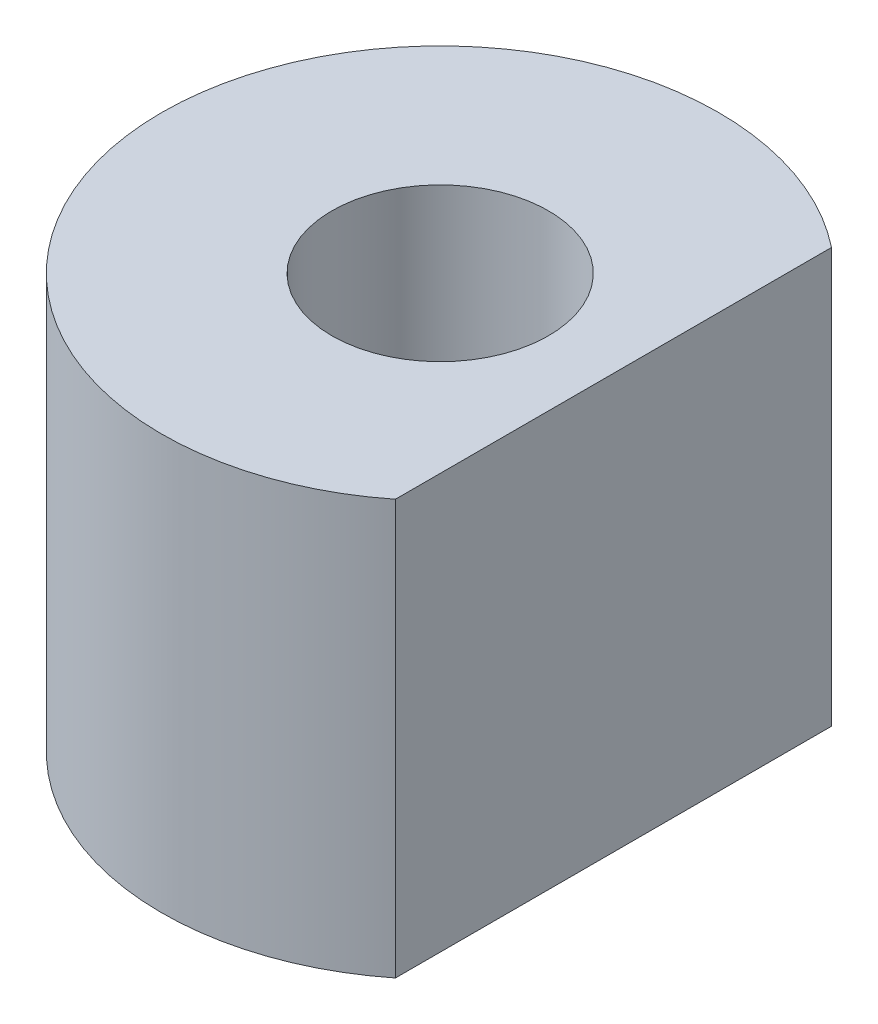
ISO-10303-21;
HEADER;
FILE_DESCRIPTION(('STEP AP214'),'2;1');
FILE_NAME('part.step','',(''),(''),'','','');
FILE_SCHEMA(('AUTOMOTIVE_DESIGN { 1 0 10303 214 1 1 1 1 }'));
ENDSEC;
DATA;
#1=APPLICATION_CONTEXT('core data for automotive mechanical design processes');
#2=APPLICATION_PROTOCOL_DEFINITION('international standard','automotive_design',2000,#1);
#3=PRODUCT_CONTEXT('',#1,'mechanical');
#4=PRODUCT('Part','Part','',(#3));
#5=PRODUCT_RELATED_PRODUCT_CATEGORY('part','',(#4));
#6=PRODUCT_DEFINITION_FORMATION('','',#4);
#7=PRODUCT_DEFINITION_CONTEXT('part definition',#1,'design');
#8=PRODUCT_DEFINITION('design','',#6,#7);
#9=PRODUCT_DEFINITION_SHAPE('','',#8);
#10=(LENGTH_UNIT() NAMED_UNIT(*) SI_UNIT(.MILLI.,.METRE.));
#11=(NAMED_UNIT(*) PLANE_ANGLE_UNIT() SI_UNIT($,.RADIAN.));
#12=(NAMED_UNIT(*) SI_UNIT($,.STERADIAN.) SOLID_ANGLE_UNIT());
#13=UNCERTAINTY_MEASURE_WITH_UNIT(LENGTH_MEASURE(1.E-05),#10,'distance_accuracy_value','');
#14=(GEOMETRIC_REPRESENTATION_CONTEXT(3) GLOBAL_UNCERTAINTY_ASSIGNED_CONTEXT((#13)) GLOBAL_UNIT_ASSIGNED_CONTEXT((#10,
#11,#12)) REPRESENTATION_CONTEXT('',''));
#15=CARTESIAN_POINT('',(0.,0.,0.));
#16=DIRECTION('',(0.,0.,1.));
#17=DIRECTION('',(1.,0.,0.));
#18=AXIS2_PLACEMENT_3D('',#15,#16,#17);
#19=CARTESIAN_POINT('',(2.8,6.7,0.));
#20=DIRECTION('',(1.,0.,0.));
#21=DIRECTION('',(0.,0.,-1.));
#22=AXIS2_PLACEMENT_3D('',#19,#20,#21);
#23=PLANE('',#22);
#24=DIRECTION('',(0.,0.,1.));
#25=VECTOR('',#24,1.);
#26=CARTESIAN_POINT('',(2.8,0.,0.));
#27=LINE('',#26,#25);
#28=CARTESIAN_POINT('',(2.8,0.,-3.52278299076171));
#29=VERTEX_POINT('',#28);
#30=CARTESIAN_POINT('',(2.8,0.,3.52278299076171));
#31=VERTEX_POINT('',#30);
#32=EDGE_CURVE('E70',#29,#31,#27,.T.);
#33=ORIENTED_EDGE('',*,*,#32,.F.);
#34=DIRECTION('',(0.,-1.,0.));
#35=VECTOR('',#34,1.);
#36=CARTESIAN_POINT('',(2.8,6.7,-3.52278299076171));
#37=LINE('',#36,#35);
#38=CARTESIAN_POINT('',(2.8,6.7,-3.52278299076171));
#39=VERTEX_POINT('',#38);
#40=EDGE_CURVE('E11',#39,#29,#37,.T.);
#41=ORIENTED_EDGE('',*,*,#40,.F.);
#42=DIRECTION('',(0.,0.,1.));
#43=VECTOR('',#42,1.);
#44=CARTESIAN_POINT('',(2.8,6.7,0.));
#45=LINE('',#44,#43);
#46=CARTESIAN_POINT('',(2.8,6.7,3.52278299076171));
#47=VERTEX_POINT('',#46);
#48=EDGE_CURVE('E71',#39,#47,#45,.T.);
#49=ORIENTED_EDGE('',*,*,#48,.T.);
#50=DIRECTION('',(0.,-1.,0.));
#51=VECTOR('',#50,1.);
#52=CARTESIAN_POINT('',(2.8,6.7,3.52278299076171));
#53=LINE('',#52,#51);
#54=EDGE_CURVE('E50',#47,#31,#53,.T.);
#55=ORIENTED_EDGE('',*,*,#54,.T.);
#56=EDGE_LOOP('',(#33,#41,#49,#55));
#57=FACE_BOUND('',#56,.T.);
#58=ADVANCED_FACE('F41',(#57),#23,.T.);
#59=CARTESIAN_POINT('',(0.,6.7,0.));
#60=DIRECTION('',(0.,-1.,0.));
#61=DIRECTION('',(0.,0.,-1.));
#62=AXIS2_PLACEMENT_3D('',#59,#60,#61);
#63=CYLINDRICAL_SURFACE('',#62,1.75);
#64=CARTESIAN_POINT('',(0.,6.7,0.));
#65=DIRECTION('',(0.,1.,0.));
#66=DIRECTION('',(0.,0.,1.));
#67=AXIS2_PLACEMENT_3D('',#64,#65,#66);
#68=CIRCLE('',#67,1.75);
#69=CARTESIAN_POINT('',(0.,6.7,1.75));
#70=VERTEX_POINT('',#69);
#71=EDGE_CURVE('E75',#70,#70,#68,.T.);
#72=ORIENTED_EDGE('',*,*,#71,.T.);
#73=EDGE_LOOP('',(#72));
#74=FACE_BOUND('',#73,.T.);
#75=CARTESIAN_POINT('',(0.,0.,0.));
#76=DIRECTION('',(0.,1.,0.));
#77=DIRECTION('',(0.,0.,1.));
#78=AXIS2_PLACEMENT_3D('',#75,#76,#77);
#79=CIRCLE('',#78,1.75);
#80=CARTESIAN_POINT('',(0.,0.,1.75));
#81=VERTEX_POINT('',#80);
#82=EDGE_CURVE('E78',#81,#81,#79,.T.);
#83=ORIENTED_EDGE('',*,*,#82,.F.);
#84=EDGE_LOOP('',(#83));
#85=FACE_BOUND('',#84,.T.);
#86=ADVANCED_FACE('F43',(#74,#85),#63,.F.);
#87=CARTESIAN_POINT('',(0.,6.7,0.));
#88=DIRECTION('',(0.,-1.,0.));
#89=DIRECTION('',(0.,0.,-1.));
#90=AXIS2_PLACEMENT_3D('',#87,#88,#89);
#91=CYLINDRICAL_SURFACE('',#90,4.5);
#92=CARTESIAN_POINT('',(0.,0.,0.));
#93=DIRECTION('',(0.,1.,0.));
#94=DIRECTION('',(0.,0.,1.));
#95=AXIS2_PLACEMENT_3D('',#92,#93,#94);
#96=CIRCLE('',#95,4.5);
#97=EDGE_CURVE('E72',#29,#31,#96,.T.);
#98=ORIENTED_EDGE('',*,*,#97,.T.);
#99=ORIENTED_EDGE('',*,*,#54,.F.);
#100=CARTESIAN_POINT('',(0.,6.7,0.));
#101=DIRECTION('',(0.,1.,0.));
#102=DIRECTION('',(0.,0.,1.));
#103=AXIS2_PLACEMENT_3D('',#100,#101,#102);
#104=CIRCLE('',#103,4.5);
#105=EDGE_CURVE('E57',#39,#47,#104,.T.);
#106=ORIENTED_EDGE('',*,*,#105,.F.);
#107=ORIENTED_EDGE('',*,*,#40,.T.);
#108=EDGE_LOOP('',(#98,#99,#106,#107));
#109=FACE_BOUND('',#108,.T.);
#110=ADVANCED_FACE('F73',(#109),#91,.T.);
#111=CARTESIAN_POINT('',(0.,6.7,0.));
#112=DIRECTION('',(0.,1.,0.));
#113=DIRECTION('',(0.,0.,1.));
#114=AXIS2_PLACEMENT_3D('',#111,#112,#113);
#115=PLANE('',#114);
#116=ORIENTED_EDGE('',*,*,#71,.F.);
#117=EDGE_LOOP('',(#116));
#118=FACE_BOUND('',#117,.T.);
#119=ORIENTED_EDGE('',*,*,#48,.F.);
#120=ORIENTED_EDGE('',*,*,#105,.T.);
#121=EDGE_LOOP('',(#119,#120));
#122=FACE_BOUND('',#121,.T.);
#123=ADVANCED_FACE('F90',(#118,#122),#115,.T.);
#124=CARTESIAN_POINT('',(0.,0.,0.));
#125=DIRECTION('',(0.,1.,0.));
#126=DIRECTION('',(0.,0.,1.));
#127=AXIS2_PLACEMENT_3D('',#124,#125,#126);
#128=PLANE('',#127);
#129=ORIENTED_EDGE('',*,*,#82,.T.);
#130=EDGE_LOOP('',(#129));
#131=FACE_BOUND('',#130,.T.);
#132=ORIENTED_EDGE('',*,*,#32,.T.);
#133=ORIENTED_EDGE('',*,*,#97,.F.);
#134=EDGE_LOOP('',(#132,#133));
#135=FACE_BOUND('',#134,.T.);
#136=ADVANCED_FACE('F77',(#131,#135),#128,.F.);
#137=CLOSED_SHELL('',(#58,#86,#110,#123,#136));
#138=MANIFOLD_SOLID_BREP('B2',#137);
#139=ADVANCED_BREP_SHAPE_REPRESENTATION('',(#18,#138),#14);
#140=SHAPE_DEFINITION_REPRESENTATION(#9,#139);
ENDSEC;
END-ISO-10303-21;
